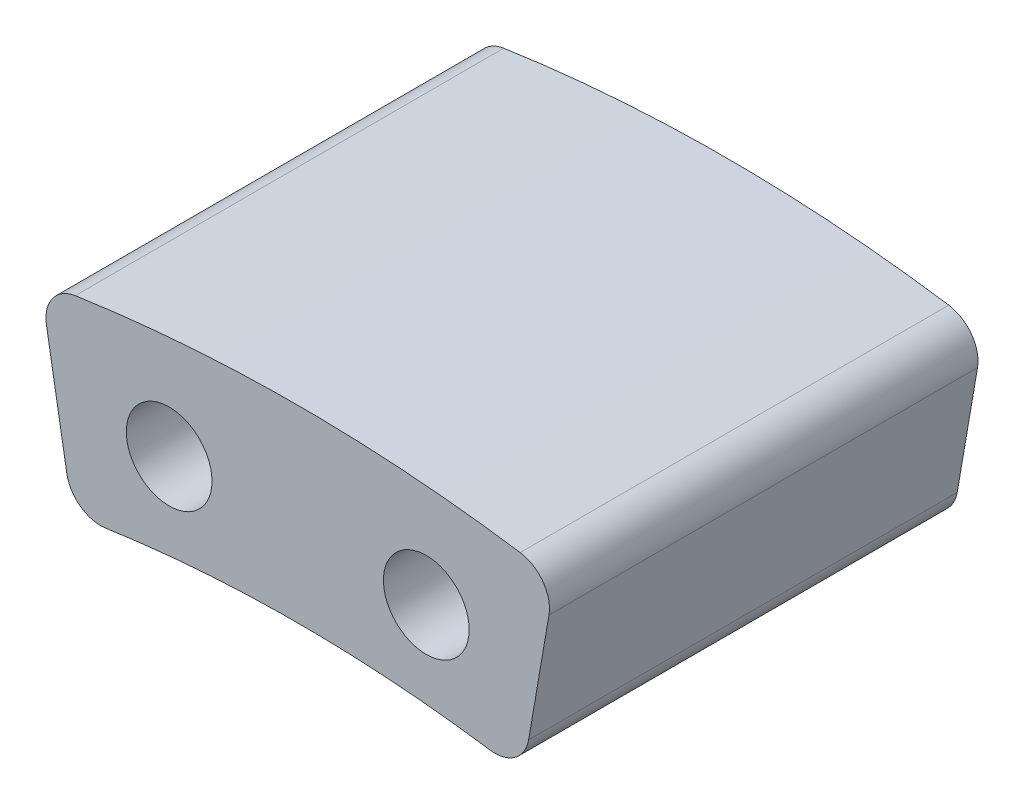
ISO-10303-21;
HEADER;
FILE_DESCRIPTION(('STEP AP214'),'2;1');
FILE_NAME('part.step','',(''),(''),'','','');
FILE_SCHEMA(('AUTOMOTIVE_DESIGN { 1 0 10303 214 1 1 1 1 }'));
ENDSEC;
DATA;
#1=APPLICATION_CONTEXT('core data for automotive mechanical design processes');
#2=APPLICATION_PROTOCOL_DEFINITION('international standard','automotive_design',2000,#1);
#3=PRODUCT_CONTEXT('',#1,'mechanical');
#4=PRODUCT('Part','Part','',(#3));
#5=PRODUCT_RELATED_PRODUCT_CATEGORY('part','',(#4));
#6=PRODUCT_DEFINITION_FORMATION('','',#4);
#7=PRODUCT_DEFINITION_CONTEXT('part definition',#1,'design');
#8=PRODUCT_DEFINITION('design','',#6,#7);
#9=PRODUCT_DEFINITION_SHAPE('','',#8);
#10=(LENGTH_UNIT() NAMED_UNIT(*) SI_UNIT(.MILLI.,.METRE.));
#11=(NAMED_UNIT(*) PLANE_ANGLE_UNIT() SI_UNIT($,.RADIAN.));
#12=(NAMED_UNIT(*) SI_UNIT($,.STERADIAN.) SOLID_ANGLE_UNIT());
#13=UNCERTAINTY_MEASURE_WITH_UNIT(LENGTH_MEASURE(1.E-05),#10,'distance_accuracy_value','');
#14=(GEOMETRIC_REPRESENTATION_CONTEXT(3) GLOBAL_UNCERTAINTY_ASSIGNED_CONTEXT((#13)) GLOBAL_UNIT_ASSIGNED_CONTEXT((#10,
#11,#12)) REPRESENTATION_CONTEXT('',''));
#15=CARTESIAN_POINT('',(0.,0.,0.));
#16=DIRECTION('',(0.,0.,1.));
#17=DIRECTION('',(1.,0.,0.));
#18=AXIS2_PLACEMENT_3D('',#15,#16,#17);
#19=CARTESIAN_POINT('',(0.,0.,31.75));
#20=DIRECTION('',(0.,0.,1.));
#21=DIRECTION('',(1.,0.,0.));
#22=AXIS2_PLACEMENT_3D('',#19,#20,#21);
#23=PLANE('',#22);
#24=CARTESIAN_POINT('',(9.525,104.341147204734,31.75));
#25=DIRECTION('',(0.,0.,1.));
#26=DIRECTION('',(1.,0.,0.));
#27=AXIS2_PLACEMENT_3D('',#24,#25,#26);
#28=CIRCLE('',#27,3.175);
#29=CARTESIAN_POINT('',(12.7,104.341147204734,31.75));
#30=VERTEX_POINT('',#29);
#31=EDGE_CURVE('E130',#30,#30,#28,.T.);
#32=ORIENTED_EDGE('',*,*,#31,.F.);
#33=EDGE_LOOP('',(#32));
#34=FACE_BOUND('',#33,.T.);
#35=DIRECTION('',(0.169491525423729,0.985531644752992,0.));
#36=VECTOR('',#35,1.);
#37=CARTESIAN_POINT('',(19.05,110.768829212013,31.75));
#38=LINE('',#37,#36);
#39=CARTESIAN_POINT('',(17.1072958063958,99.4727101027838,31.75));
#40=VERTEX_POINT('',#39);
#41=CARTESIAN_POINT('',(18.6145138834901,108.236635654853,31.75));
#42=VERTEX_POINT('',#41);
#43=EDGE_CURVE('E139',#40,#42,#38,.T.);
#44=ORIENTED_EDGE('',*,*,#43,.T.);
#45=CARTESIAN_POINT('',(16.1112635058175,108.667144129429,31.75));
#46=DIRECTION('',(0.,0.,1.));
#47=DIRECTION('',(1.,0.,0.));
#48=AXIS2_PLACEMENT_3D('',#45,#46,#47);
#49=CIRCLE('',#48,2.54);
#50=CARTESIAN_POINT('',(16.4837782689577,111.179679253809,31.75));
#51=VERTEX_POINT('',#50);
#52=EDGE_CURVE('E158',#42,#51,#49,.T.);
#53=ORIENTED_EDGE('',*,*,#52,.T.);
#54=CARTESIAN_POINT('',(0.,0.,31.75));
#55=DIRECTION('',(0.,0.,1.));
#56=DIRECTION('',(1.,0.,0.));
#57=AXIS2_PLACEMENT_3D('',#54,#55,#56);
#58=CIRCLE('',#57,112.395);
#59=CARTESIAN_POINT('',(-16.4837782689577,111.179679253809,31.75));
#60=VERTEX_POINT('',#59);
#61=EDGE_CURVE('E122',#51,#60,#58,.T.);
#62=ORIENTED_EDGE('',*,*,#61,.T.);
#63=CARTESIAN_POINT('',(-16.1112635058175,108.667144129429,31.75));
#64=DIRECTION('',(0.,0.,1.));
#65=DIRECTION('',(1.,0.,0.));
#66=AXIS2_PLACEMENT_3D('',#63,#64,#65);
#67=CIRCLE('',#66,2.54);
#68=CARTESIAN_POINT('',(-18.6145138834901,108.236635654853,31.75));
#69=VERTEX_POINT('',#68);
#70=EDGE_CURVE('E153',#60,#69,#67,.T.);
#71=ORIENTED_EDGE('',*,*,#70,.T.);
#72=DIRECTION('',(0.169491525423729,-0.985531644752992,0.));
#73=VECTOR('',#72,1.);
#74=CARTESIAN_POINT('',(-19.05,110.768829212013,31.75));
#75=LINE('',#74,#73);
#76=CARTESIAN_POINT('',(-17.1072958063958,99.4727101027838,31.75));
#77=VERTEX_POINT('',#76);
#78=EDGE_CURVE('E169',#69,#77,#75,.T.);
#79=ORIENTED_EDGE('',*,*,#78,.T.);
#80=CARTESIAN_POINT('',(-14.6040454287232,99.9032185773601,31.75));
#81=DIRECTION('',(0.,0.,1.));
#82=DIRECTION('',(1.,0.,0.));
#83=AXIS2_PLACEMENT_3D('',#80,#81,#82);
#84=CIRCLE('',#83,2.54);
#85=CARTESIAN_POINT('',(-14.2366480594471,97.3899300596907,31.75));
#86=VERTEX_POINT('',#85);
#87=EDGE_CURVE('E58',#77,#86,#84,.T.);
#88=ORIENTED_EDGE('',*,*,#87,.T.);
#89=CARTESIAN_POINT('',(0.,0.,31.75));
#90=DIRECTION('',(0.,0.,-1.));
#91=DIRECTION('',(1.,0.,0.));
#92=AXIS2_PLACEMENT_3D('',#89,#90,#91);
#93=CIRCLE('',#92,98.425);
#94=CARTESIAN_POINT('',(14.2366480594471,97.3899300596907,31.75));
#95=VERTEX_POINT('',#94);
#96=EDGE_CURVE('E177',#86,#95,#93,.T.);
#97=ORIENTED_EDGE('',*,*,#96,.T.);
#98=CARTESIAN_POINT('',(14.6040454287232,99.9032185773601,31.75));
#99=DIRECTION('',(0.,0.,1.));
#100=DIRECTION('',(1.,0.,0.));
#101=AXIS2_PLACEMENT_3D('',#98,#99,#100);
#102=CIRCLE('',#101,2.54);
#103=EDGE_CURVE('E156',#95,#40,#102,.T.);
#104=ORIENTED_EDGE('',*,*,#103,.T.);
#105=EDGE_LOOP('',(#44,#53,#62,#71,#79,#88,#97,#104));
#106=FACE_BOUND('',#105,.T.);
#107=CARTESIAN_POINT('',(-9.525,104.341147204734,31.75));
#108=DIRECTION('',(0.,0.,1.));
#109=DIRECTION('',(1.,0.,0.));
#110=AXIS2_PLACEMENT_3D('',#107,#108,#109);
#111=CIRCLE('',#110,3.175);
#112=CARTESIAN_POINT('',(-6.35,104.341147204734,31.75));
#113=VERTEX_POINT('',#112);
#114=EDGE_CURVE('E184',#113,#113,#111,.T.);
#115=ORIENTED_EDGE('',*,*,#114,.F.);
#116=EDGE_LOOP('',(#115));
#117=FACE_BOUND('',#116,.T.);
#118=ADVANCED_FACE('F36',(#34,#106,#117),#23,.T.);
#119=CARTESIAN_POINT('',(0.,0.,0.));
#120=DIRECTION('',(0.,0.,1.));
#121=DIRECTION('',(1.,0.,0.));
#122=AXIS2_PLACEMENT_3D('',#119,#120,#121);
#123=PLANE('',#122);
#124=CARTESIAN_POINT('',(0.,0.,0.));
#125=DIRECTION('',(0.,0.,1.));
#126=DIRECTION('',(1.,0.,0.));
#127=AXIS2_PLACEMENT_3D('',#124,#125,#126);
#128=CIRCLE('',#127,112.395);
#129=CARTESIAN_POINT('',(16.4837782689577,111.179679253809,0.));
#130=VERTEX_POINT('',#129);
#131=CARTESIAN_POINT('',(-16.4837782689577,111.179679253809,0.));
#132=VERTEX_POINT('',#131);
#133=EDGE_CURVE('E119',#130,#132,#128,.T.);
#134=ORIENTED_EDGE('',*,*,#133,.F.);
#135=CARTESIAN_POINT('',(16.1112635058175,108.667144129429,0.));
#136=DIRECTION('',(0.,0.,1.));
#137=DIRECTION('',(1.,0.,0.));
#138=AXIS2_PLACEMENT_3D('',#135,#136,#137);
#139=CIRCLE('',#138,2.54);
#140=CARTESIAN_POINT('',(18.6145138834901,108.236635654853,0.));
#141=VERTEX_POINT('',#140);
#142=EDGE_CURVE('E102',#130,#141,#139,.F.);
#143=ORIENTED_EDGE('',*,*,#142,.T.);
#144=DIRECTION('',(0.169491525423729,0.985531644752992,0.));
#145=VECTOR('',#144,1.);
#146=CARTESIAN_POINT('',(19.05,110.768829212013,0.));
#147=LINE('',#146,#145);
#148=CARTESIAN_POINT('',(17.1072958063958,99.4727101027838,0.));
#149=VERTEX_POINT('',#148);
#150=EDGE_CURVE('E143',#149,#141,#147,.T.);
#151=ORIENTED_EDGE('',*,*,#150,.F.);
#152=CARTESIAN_POINT('',(14.6040454287232,99.9032185773601,0.));
#153=DIRECTION('',(0.,0.,1.));
#154=DIRECTION('',(1.,0.,0.));
#155=AXIS2_PLACEMENT_3D('',#152,#153,#154);
#156=CIRCLE('',#155,2.54);
#157=CARTESIAN_POINT('',(14.2366480594471,97.3899300596907,0.));
#158=VERTEX_POINT('',#157);
#159=EDGE_CURVE('E113',#149,#158,#156,.F.);
#160=ORIENTED_EDGE('',*,*,#159,.T.);
#161=CARTESIAN_POINT('',(0.,0.,0.));
#162=DIRECTION('',(0.,0.,-1.));
#163=DIRECTION('',(1.,0.,0.));
#164=AXIS2_PLACEMENT_3D('',#161,#162,#163);
#165=CIRCLE('',#164,98.425);
#166=CARTESIAN_POINT('',(-14.2366480594471,97.3899300596907,0.));
#167=VERTEX_POINT('',#166);
#168=EDGE_CURVE('E133',#167,#158,#165,.T.);
#169=ORIENTED_EDGE('',*,*,#168,.F.);
#170=CARTESIAN_POINT('',(-14.6040454287232,99.9032185773601,0.));
#171=DIRECTION('',(0.,0.,1.));
#172=DIRECTION('',(1.,0.,0.));
#173=AXIS2_PLACEMENT_3D('',#170,#171,#172);
#174=CIRCLE('',#173,2.54);
#175=CARTESIAN_POINT('',(-17.1072958063958,99.4727101027838,0.));
#176=VERTEX_POINT('',#175);
#177=EDGE_CURVE('E147',#167,#176,#174,.F.);
#178=ORIENTED_EDGE('',*,*,#177,.T.);
#179=DIRECTION('',(0.169491525423729,-0.985531644752992,0.));
#180=VECTOR('',#179,1.);
#181=CARTESIAN_POINT('',(-19.05,110.768829212013,0.));
#182=LINE('',#181,#180);
#183=CARTESIAN_POINT('',(-18.6145138834901,108.236635654853,0.));
#184=VERTEX_POINT('',#183);
#185=EDGE_CURVE('E129',#184,#176,#182,.T.);
#186=ORIENTED_EDGE('',*,*,#185,.F.);
#187=CARTESIAN_POINT('',(-16.1112635058175,108.667144129429,0.));
#188=DIRECTION('',(0.,0.,1.));
#189=DIRECTION('',(1.,0.,0.));
#190=AXIS2_PLACEMENT_3D('',#187,#188,#189);
#191=CIRCLE('',#190,2.54);
#192=EDGE_CURVE('E123',#184,#132,#191,.F.);
#193=ORIENTED_EDGE('',*,*,#192,.T.);
#194=EDGE_LOOP('',(#134,#143,#151,#160,#169,#178,#186,#193));
#195=FACE_BOUND('',#194,.T.);
#196=CARTESIAN_POINT('',(9.525,104.341147204734,0.));
#197=DIRECTION('',(0.,0.,1.));
#198=DIRECTION('',(1.,0.,0.));
#199=AXIS2_PLACEMENT_3D('',#196,#197,#198);
#200=CIRCLE('',#199,3.175);
#201=CARTESIAN_POINT('',(12.7,104.341147204734,0.));
#202=VERTEX_POINT('',#201);
#203=EDGE_CURVE('E136',#202,#202,#200,.T.);
#204=ORIENTED_EDGE('',*,*,#203,.T.);
#205=EDGE_LOOP('',(#204));
#206=FACE_BOUND('',#205,.T.);
#207=CARTESIAN_POINT('',(-9.525,104.341147204734,0.));
#208=DIRECTION('',(0.,0.,1.));
#209=DIRECTION('',(1.,0.,0.));
#210=AXIS2_PLACEMENT_3D('',#207,#208,#209);
#211=CIRCLE('',#210,3.175);
#212=CARTESIAN_POINT('',(-6.35,104.341147204734,0.));
#213=VERTEX_POINT('',#212);
#214=EDGE_CURVE('E186',#213,#213,#211,.T.);
#215=ORIENTED_EDGE('',*,*,#214,.T.);
#216=EDGE_LOOP('',(#215));
#217=FACE_BOUND('',#216,.T.);
#218=ADVANCED_FACE('F126',(#195,#206,#217),#123,.F.);
#219=CARTESIAN_POINT('',(0.,0.,31.75));
#220=DIRECTION('',(0.,0.,-1.));
#221=DIRECTION('',(-1.,0.,0.));
#222=AXIS2_PLACEMENT_3D('',#219,#220,#221);
#223=CYLINDRICAL_SURFACE('',#222,112.395);
#224=ORIENTED_EDGE('',*,*,#61,.F.);
#225=DIRECTION('',(0.,0.,-1.));
#226=VECTOR('',#225,1.);
#227=CARTESIAN_POINT('',(16.4837782689577,111.179679253809,31.75));
#228=LINE('',#227,#226);
#229=EDGE_CURVE('E106',#51,#130,#228,.T.);
#230=ORIENTED_EDGE('',*,*,#229,.T.);
#231=ORIENTED_EDGE('',*,*,#133,.T.);
#232=DIRECTION('',(0.,0.,-1.));
#233=VECTOR('',#232,1.);
#234=CARTESIAN_POINT('',(-16.4837782689577,111.179679253809,31.75));
#235=LINE('',#234,#233);
#236=EDGE_CURVE('E124',#132,#60,#235,.F.);
#237=ORIENTED_EDGE('',*,*,#236,.T.);
#238=EDGE_LOOP('',(#224,#230,#231,#237));
#239=FACE_BOUND('',#238,.T.);
#240=ADVANCED_FACE('F118',(#239),#223,.T.);
#241=CARTESIAN_POINT('',(-19.05,110.768829212013,31.75));
#242=DIRECTION('',(0.985531644752992,0.169491525423729,0.));
#243=DIRECTION('',(-0.169491525423729,0.985531644752992,0.));
#244=AXIS2_PLACEMENT_3D('',#241,#242,#243);
#245=PLANE('',#244);
#246=ORIENTED_EDGE('',*,*,#185,.T.);
#247=DIRECTION('',(0.,0.,-1.));
#248=VECTOR('',#247,1.);
#249=CARTESIAN_POINT('',(-17.1072958063958,99.4727101027838,31.75));
#250=LINE('',#249,#248);
#251=EDGE_CURVE('E11',#176,#77,#250,.F.);
#252=ORIENTED_EDGE('',*,*,#251,.T.);
#253=ORIENTED_EDGE('',*,*,#78,.F.);
#254=DIRECTION('',(0.,0.,-1.));
#255=VECTOR('',#254,1.);
#256=CARTESIAN_POINT('',(-18.6145138834901,108.236635654853,31.75));
#257=LINE('',#256,#255);
#258=EDGE_CURVE('E44',#69,#184,#257,.T.);
#259=ORIENTED_EDGE('',*,*,#258,.T.);
#260=EDGE_LOOP('',(#246,#252,#253,#259));
#261=FACE_BOUND('',#260,.T.);
#262=ADVANCED_FACE('F167',(#261),#245,.F.);
#263=CARTESIAN_POINT('',(0.,0.,31.75));
#264=DIRECTION('',(0.,0.,-1.));
#265=DIRECTION('',(-1.,0.,0.));
#266=AXIS2_PLACEMENT_3D('',#263,#264,#265);
#267=CYLINDRICAL_SURFACE('',#266,98.425);
#268=ORIENTED_EDGE('',*,*,#168,.T.);
#269=DIRECTION('',(0.,0.,-1.));
#270=VECTOR('',#269,1.);
#271=CARTESIAN_POINT('',(14.2366480594471,97.3899300596907,31.75));
#272=LINE('',#271,#270);
#273=EDGE_CURVE('E51',#158,#95,#272,.F.);
#274=ORIENTED_EDGE('',*,*,#273,.T.);
#275=ORIENTED_EDGE('',*,*,#96,.F.);
#276=DIRECTION('',(0.,0.,-1.));
#277=VECTOR('',#276,1.);
#278=CARTESIAN_POINT('',(-14.2366480594471,97.3899300596907,31.75));
#279=LINE('',#278,#277);
#280=EDGE_CURVE('E160',#86,#167,#279,.T.);
#281=ORIENTED_EDGE('',*,*,#280,.T.);
#282=EDGE_LOOP('',(#268,#274,#275,#281));
#283=FACE_BOUND('',#282,.T.);
#284=ADVANCED_FACE('F176',(#283),#267,.F.);
#285=CARTESIAN_POINT('',(19.05,110.768829212013,31.75));
#286=DIRECTION('',(-0.985531644752992,0.169491525423729,0.));
#287=DIRECTION('',(-0.169491525423729,-0.985531644752992,0.));
#288=AXIS2_PLACEMENT_3D('',#285,#286,#287);
#289=PLANE('',#288);
#290=ORIENTED_EDGE('',*,*,#150,.T.);
#291=DIRECTION('',(0.,0.,-1.));
#292=VECTOR('',#291,1.);
#293=CARTESIAN_POINT('',(18.6145138834901,108.236635654853,31.75));
#294=LINE('',#293,#292);
#295=EDGE_CURVE('E107',#141,#42,#294,.F.);
#296=ORIENTED_EDGE('',*,*,#295,.T.);
#297=ORIENTED_EDGE('',*,*,#43,.F.);
#298=DIRECTION('',(0.,0.,-1.));
#299=VECTOR('',#298,1.);
#300=CARTESIAN_POINT('',(17.1072958063958,99.4727101027838,31.75));
#301=LINE('',#300,#299);
#302=EDGE_CURVE('E112',#40,#149,#301,.T.);
#303=ORIENTED_EDGE('',*,*,#302,.T.);
#304=EDGE_LOOP('',(#290,#296,#297,#303));
#305=FACE_BOUND('',#304,.T.);
#306=ADVANCED_FACE('F207',(#305),#289,.F.);
#307=CARTESIAN_POINT('',(9.525,104.341147204734,31.75));
#308=DIRECTION('',(0.,0.,-1.));
#309=DIRECTION('',(-1.,0.,0.));
#310=AXIS2_PLACEMENT_3D('',#307,#308,#309);
#311=CYLINDRICAL_SURFACE('',#310,3.175);
#312=ORIENTED_EDGE('',*,*,#31,.T.);
#313=EDGE_LOOP('',(#312));
#314=FACE_BOUND('',#313,.T.);
#315=ORIENTED_EDGE('',*,*,#203,.F.);
#316=EDGE_LOOP('',(#315));
#317=FACE_BOUND('',#316,.T.);
#318=ADVANCED_FACE('F204',(#314,#317),#311,.F.);
#319=CARTESIAN_POINT('',(-9.525,104.341147204734,31.75));
#320=DIRECTION('',(0.,0.,-1.));
#321=DIRECTION('',(-1.,0.,0.));
#322=AXIS2_PLACEMENT_3D('',#319,#320,#321);
#323=CYLINDRICAL_SURFACE('',#322,3.175);
#324=ORIENTED_EDGE('',*,*,#114,.T.);
#325=EDGE_LOOP('',(#324));
#326=FACE_BOUND('',#325,.T.);
#327=ORIENTED_EDGE('',*,*,#214,.F.);
#328=EDGE_LOOP('',(#327));
#329=FACE_BOUND('',#328,.T.);
#330=ADVANCED_FACE('F192',(#326,#329),#323,.F.);
#331=CARTESIAN_POINT('',(16.1112635058175,108.667144129429,31.75));
#332=DIRECTION('',(0.,0.,-1.));
#333=DIRECTION('',(-1.,0.,0.));
#334=AXIS2_PLACEMENT_3D('',#331,#332,#333);
#335=CYLINDRICAL_SURFACE('',#334,2.54);
#336=ORIENTED_EDGE('',*,*,#52,.F.);
#337=ORIENTED_EDGE('',*,*,#295,.F.);
#338=ORIENTED_EDGE('',*,*,#142,.F.);
#339=ORIENTED_EDGE('',*,*,#229,.F.);
#340=EDGE_LOOP('',(#336,#337,#338,#339));
#341=FACE_BOUND('',#340,.T.);
#342=ADVANCED_FACE('F105',(#341),#335,.T.);
#343=CARTESIAN_POINT('',(14.6040454287232,99.9032185773601,31.75));
#344=DIRECTION('',(0.,0.,-1.));
#345=DIRECTION('',(-1.,0.,0.));
#346=AXIS2_PLACEMENT_3D('',#343,#344,#345);
#347=CYLINDRICAL_SURFACE('',#346,2.54);
#348=ORIENTED_EDGE('',*,*,#103,.F.);
#349=ORIENTED_EDGE('',*,*,#273,.F.);
#350=ORIENTED_EDGE('',*,*,#159,.F.);
#351=ORIENTED_EDGE('',*,*,#302,.F.);
#352=EDGE_LOOP('',(#348,#349,#350,#351));
#353=FACE_BOUND('',#352,.T.);
#354=ADVANCED_FACE('F219',(#353),#347,.T.);
#355=CARTESIAN_POINT('',(-14.6040454287232,99.9032185773601,31.75));
#356=DIRECTION('',(0.,0.,-1.));
#357=DIRECTION('',(-1.,0.,0.));
#358=AXIS2_PLACEMENT_3D('',#355,#356,#357);
#359=CYLINDRICAL_SURFACE('',#358,2.54);
#360=ORIENTED_EDGE('',*,*,#87,.F.);
#361=ORIENTED_EDGE('',*,*,#251,.F.);
#362=ORIENTED_EDGE('',*,*,#177,.F.);
#363=ORIENTED_EDGE('',*,*,#280,.F.);
#364=EDGE_LOOP('',(#360,#361,#362,#363));
#365=FACE_BOUND('',#364,.T.);
#366=ADVANCED_FACE('F175',(#365),#359,.T.);
#367=CARTESIAN_POINT('',(-16.1112635058175,108.667144129429,31.75));
#368=DIRECTION('',(0.,0.,-1.));
#369=DIRECTION('',(-1.,0.,0.));
#370=AXIS2_PLACEMENT_3D('',#367,#368,#369);
#371=CYLINDRICAL_SURFACE('',#370,2.54);
#372=ORIENTED_EDGE('',*,*,#70,.F.);
#373=ORIENTED_EDGE('',*,*,#236,.F.);
#374=ORIENTED_EDGE('',*,*,#192,.F.);
#375=ORIENTED_EDGE('',*,*,#258,.F.);
#376=EDGE_LOOP('',(#372,#373,#374,#375));
#377=FACE_BOUND('',#376,.T.);
#378=ADVANCED_FACE('F38',(#377),#371,.T.);
#379=CLOSED_SHELL('',(#118,#218,#240,#262,#284,#306,#318,#330,#342,#354,#366,#378));
#380=MANIFOLD_SOLID_BREP('B2',#379);
#381=ADVANCED_BREP_SHAPE_REPRESENTATION('',(#18,#380),#14);
#382=SHAPE_DEFINITION_REPRESENTATION(#9,#381);
ENDSEC;
END-ISO-10303-21;
